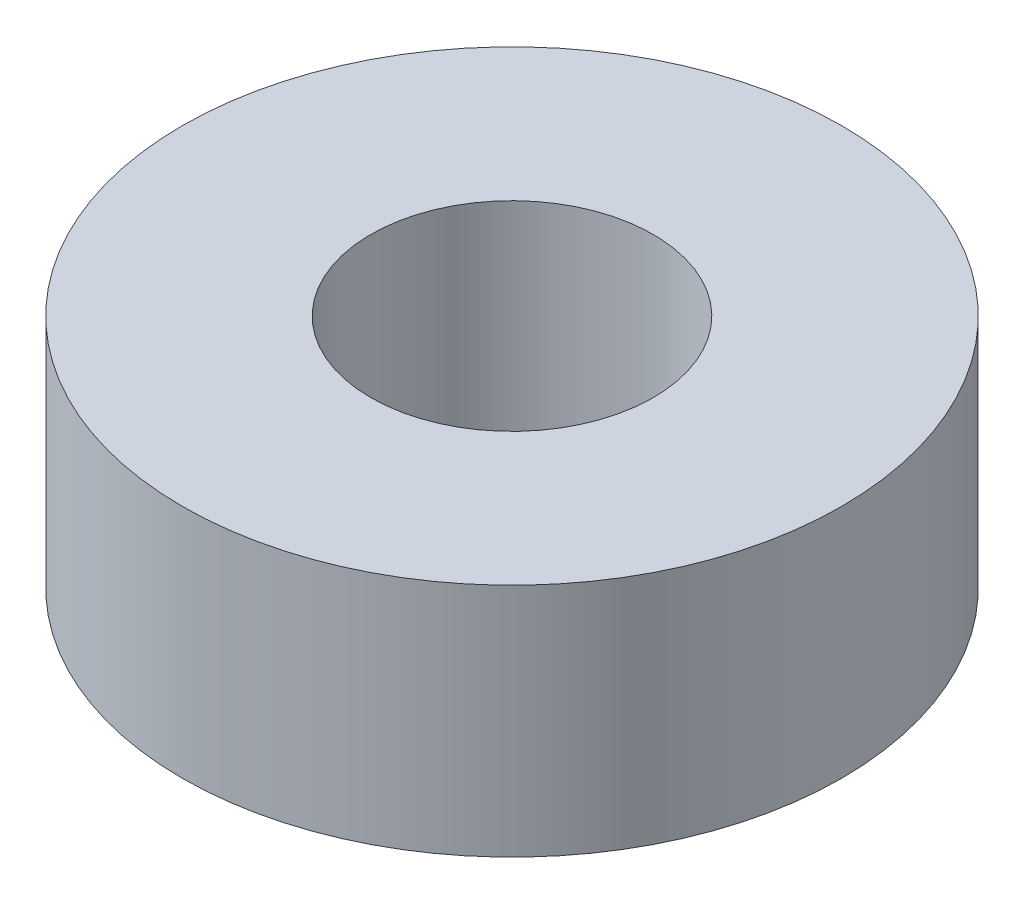
ISO-10303-21;
HEADER;
FILE_DESCRIPTION(('STEP AP214'),'2;1');
FILE_NAME('part.step','',(''),(''),'','','');
FILE_SCHEMA(('AUTOMOTIVE_DESIGN { 1 0 10303 214 1 1 1 1 }'));
ENDSEC;
DATA;
#1=APPLICATION_CONTEXT('core data for automotive mechanical design processes');
#2=APPLICATION_PROTOCOL_DEFINITION('international standard','automotive_design',2000,#1);
#3=PRODUCT_CONTEXT('',#1,'mechanical');
#4=PRODUCT('Part','Part','',(#3));
#5=PRODUCT_RELATED_PRODUCT_CATEGORY('part','',(#4));
#6=PRODUCT_DEFINITION_FORMATION('','',#4);
#7=PRODUCT_DEFINITION_CONTEXT('part definition',#1,'design');
#8=PRODUCT_DEFINITION('design','',#6,#7);
#9=PRODUCT_DEFINITION_SHAPE('','',#8);
#10=(LENGTH_UNIT() NAMED_UNIT(*) SI_UNIT(.MILLI.,.METRE.));
#11=(NAMED_UNIT(*) PLANE_ANGLE_UNIT() SI_UNIT($,.RADIAN.));
#12=(NAMED_UNIT(*) SI_UNIT($,.STERADIAN.) SOLID_ANGLE_UNIT());
#13=UNCERTAINTY_MEASURE_WITH_UNIT(LENGTH_MEASURE(1.E-05),#10,'distance_accuracy_value','');
#14=(GEOMETRIC_REPRESENTATION_CONTEXT(3) GLOBAL_UNCERTAINTY_ASSIGNED_CONTEXT((#13)) GLOBAL_UNIT_ASSIGNED_CONTEXT((#10,
#11,#12)) REPRESENTATION_CONTEXT('',''));
#15=CARTESIAN_POINT('',(0.,0.,0.));
#16=DIRECTION('',(0.,0.,1.));
#17=DIRECTION('',(1.,0.,0.));
#18=AXIS2_PLACEMENT_3D('',#15,#16,#17);
#19=CARTESIAN_POINT('',(0.,5.,0.));
#20=DIRECTION('',(0.,1.,0.));
#21=DIRECTION('',(0.,0.,1.));
#22=AXIS2_PLACEMENT_3D('',#19,#20,#21);
#23=PLANE('',#22);
#24=CARTESIAN_POINT('',(0.,5.,0.));
#25=DIRECTION('',(0.,1.,0.));
#26=DIRECTION('',(0.,0.,1.));
#27=AXIS2_PLACEMENT_3D('',#24,#25,#26);
#28=CIRCLE('',#27,7.);
#29=CARTESIAN_POINT('',(0.,5.,7.));
#30=VERTEX_POINT('',#29);
#31=EDGE_CURVE('E10',#30,#30,#28,.T.);
#32=ORIENTED_EDGE('',*,*,#31,.T.);
#33=EDGE_LOOP('',(#32));
#34=FACE_BOUND('',#33,.T.);
#35=CARTESIAN_POINT('',(0.,5.,0.));
#36=DIRECTION('',(0.,1.,0.));
#37=DIRECTION('',(0.,0.,1.));
#38=AXIS2_PLACEMENT_3D('',#35,#36,#37);
#39=CIRCLE('',#38,3.);
#40=CARTESIAN_POINT('',(0.,5.,3.));
#41=VERTEX_POINT('',#40);
#42=EDGE_CURVE('E48',#41,#41,#39,.T.);
#43=ORIENTED_EDGE('',*,*,#42,.F.);
#44=EDGE_LOOP('',(#43));
#45=FACE_BOUND('',#44,.T.);
#46=ADVANCED_FACE('F33',(#34,#45),#23,.T.);
#47=CARTESIAN_POINT('',(0.,0.,0.));
#48=DIRECTION('',(0.,1.,0.));
#49=DIRECTION('',(0.,0.,1.));
#50=AXIS2_PLACEMENT_3D('',#47,#48,#49);
#51=PLANE('',#50);
#52=CARTESIAN_POINT('',(0.,0.,0.));
#53=DIRECTION('',(0.,1.,0.));
#54=DIRECTION('',(0.,0.,1.));
#55=AXIS2_PLACEMENT_3D('',#52,#53,#54);
#56=CIRCLE('',#55,7.);
#57=CARTESIAN_POINT('',(0.,0.,7.));
#58=VERTEX_POINT('',#57);
#59=EDGE_CURVE('E37',#58,#58,#56,.T.);
#60=ORIENTED_EDGE('',*,*,#59,.F.);
#61=EDGE_LOOP('',(#60));
#62=FACE_BOUND('',#61,.T.);
#63=CARTESIAN_POINT('',(0.,0.,0.));
#64=DIRECTION('',(0.,1.,0.));
#65=DIRECTION('',(0.,0.,1.));
#66=AXIS2_PLACEMENT_3D('',#63,#64,#65);
#67=CIRCLE('',#66,3.);
#68=CARTESIAN_POINT('',(0.,0.,3.));
#69=VERTEX_POINT('',#68);
#70=EDGE_CURVE('E50',#69,#69,#67,.T.);
#71=ORIENTED_EDGE('',*,*,#70,.T.);
#72=EDGE_LOOP('',(#71));
#73=FACE_BOUND('',#72,.T.);
#74=ADVANCED_FACE('F60',(#62,#73),#51,.F.);
#75=CARTESIAN_POINT('',(0.,5.,0.));
#76=DIRECTION('',(0.,-1.,0.));
#77=DIRECTION('',(0.,0.,-1.));
#78=AXIS2_PLACEMENT_3D('',#75,#76,#77);
#79=CYLINDRICAL_SURFACE('',#78,7.);
#80=ORIENTED_EDGE('',*,*,#31,.F.);
#81=EDGE_LOOP('',(#80));
#82=FACE_BOUND('',#81,.T.);
#83=ORIENTED_EDGE('',*,*,#59,.T.);
#84=EDGE_LOOP('',(#83));
#85=FACE_BOUND('',#84,.T.);
#86=ADVANCED_FACE('F35',(#82,#85),#79,.T.);
#87=CARTESIAN_POINT('',(0.,5.,0.));
#88=DIRECTION('',(0.,-1.,0.));
#89=DIRECTION('',(0.,0.,-1.));
#90=AXIS2_PLACEMENT_3D('',#87,#88,#89);
#91=CYLINDRICAL_SURFACE('',#90,3.);
#92=ORIENTED_EDGE('',*,*,#42,.T.);
#93=EDGE_LOOP('',(#92));
#94=FACE_BOUND('',#93,.T.);
#95=ORIENTED_EDGE('',*,*,#70,.F.);
#96=EDGE_LOOP('',(#95));
#97=FACE_BOUND('',#96,.T.);
#98=ADVANCED_FACE('F56',(#94,#97),#91,.F.);
#99=CLOSED_SHELL('',(#46,#74,#86,#98));
#100=MANIFOLD_SOLID_BREP('B2',#99);
#101=ADVANCED_BREP_SHAPE_REPRESENTATION('',(#18,#100),#14);
#102=SHAPE_DEFINITION_REPRESENTATION(#9,#101);
ENDSEC;
END-ISO-10303-21;
